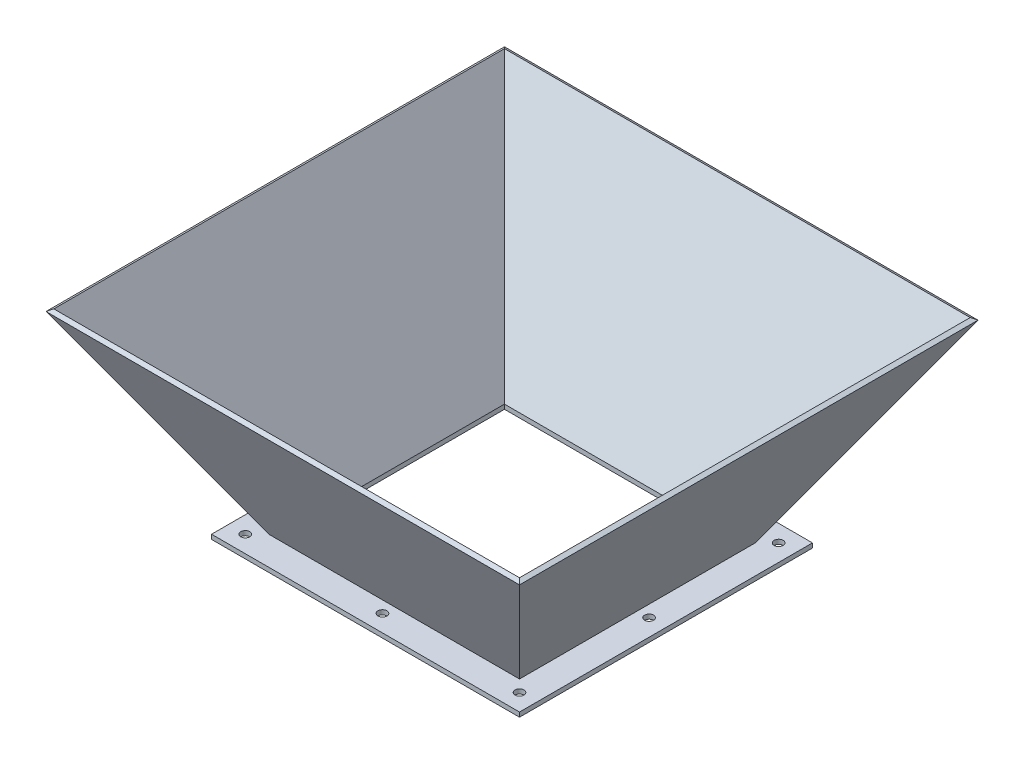
ISO-10303-21;
HEADER;
FILE_DESCRIPTION(('STEP AP214'),'2;1');
FILE_NAME('part.step','',(''),(''),'','','');
FILE_SCHEMA(('AUTOMOTIVE_DESIGN { 1 0 10303 214 1 1 1 1 }'));
ENDSEC;
DATA;
#1=APPLICATION_CONTEXT('core data for automotive mechanical design processes');
#2=APPLICATION_PROTOCOL_DEFINITION('international standard','automotive_design',2000,#1);
#3=PRODUCT_CONTEXT('',#1,'mechanical');
#4=PRODUCT('Part','Part','',(#3));
#5=PRODUCT_RELATED_PRODUCT_CATEGORY('part','',(#4));
#6=PRODUCT_DEFINITION_FORMATION('','',#4);
#7=PRODUCT_DEFINITION_CONTEXT('part definition',#1,'design');
#8=PRODUCT_DEFINITION('design','',#6,#7);
#9=PRODUCT_DEFINITION_SHAPE('','',#8);
#10=(LENGTH_UNIT() NAMED_UNIT(*) SI_UNIT(.MILLI.,.METRE.));
#11=(NAMED_UNIT(*) PLANE_ANGLE_UNIT() SI_UNIT($,.RADIAN.));
#12=(NAMED_UNIT(*) SI_UNIT($,.STERADIAN.) SOLID_ANGLE_UNIT());
#13=UNCERTAINTY_MEASURE_WITH_UNIT(LENGTH_MEASURE(1.E-05),#10,'distance_accuracy_value','');
#14=(GEOMETRIC_REPRESENTATION_CONTEXT(3) GLOBAL_UNCERTAINTY_ASSIGNED_CONTEXT((#13)) GLOBAL_UNIT_ASSIGNED_CONTEXT((#10,
#11,#12)) REPRESENTATION_CONTEXT('',''));
#15=CARTESIAN_POINT('',(0.,0.,0.));
#16=DIRECTION('',(0.,0.,1.));
#17=DIRECTION('',(1.,0.,0.));
#18=AXIS2_PLACEMENT_3D('',#15,#16,#17);
#19=CARTESIAN_POINT('',(-338.536777087592,0.,-200.));
#20=DIRECTION('',(0.,1.,0.));
#21=DIRECTION('',(0.,0.,1.));
#22=AXIS2_PLACEMENT_3D('',#19,#20,#21);
#23=PLANE('',#22);
#24=CARTESIAN_POINT('',(-91.25,0.,86.25));
#25=DIRECTION('',(0.,1.,0.));
#26=DIRECTION('',(0.,0.,1.));
#27=AXIS2_PLACEMENT_3D('',#24,#25,#26);
#28=CIRCLE('',#27,2.99999999999999);
#29=CARTESIAN_POINT('',(-91.25,0.,89.25));
#30=VERTEX_POINT('',#29);
#31=EDGE_CURVE('E548',#30,#30,#28,.T.);
#32=ORIENTED_EDGE('',*,*,#31,.F.);
#33=EDGE_LOOP('',(#32));
#34=FACE_BOUND('',#33,.T.);
#35=CARTESIAN_POINT('',(0.,0.,86.25));
#36=DIRECTION('',(0.,1.,0.));
#37=DIRECTION('',(0.,0.,1.));
#38=AXIS2_PLACEMENT_3D('',#35,#36,#37);
#39=CIRCLE('',#38,3.);
#40=CARTESIAN_POINT('',(0.,0.,89.25));
#41=VERTEX_POINT('',#40);
#42=EDGE_CURVE('E542',#41,#41,#39,.T.);
#43=ORIENTED_EDGE('',*,*,#42,.F.);
#44=EDGE_LOOP('',(#43));
#45=FACE_BOUND('',#44,.T.);
#46=CARTESIAN_POINT('',(91.25,0.,86.25));
#47=DIRECTION('',(0.,1.,0.));
#48=DIRECTION('',(0.,0.,1.));
#49=AXIS2_PLACEMENT_3D('',#46,#47,#48);
#50=CIRCLE('',#49,3.00000000000001);
#51=CARTESIAN_POINT('',(91.25,0.,89.25));
#52=VERTEX_POINT('',#51);
#53=EDGE_CURVE('E536',#52,#52,#50,.T.);
#54=ORIENTED_EDGE('',*,*,#53,.F.);
#55=EDGE_LOOP('',(#54));
#56=FACE_BOUND('',#55,.T.);
#57=CARTESIAN_POINT('',(91.25,0.,0.));
#58=DIRECTION('',(0.,1.,0.));
#59=DIRECTION('',(0.,0.,1.));
#60=AXIS2_PLACEMENT_3D('',#57,#58,#59);
#61=CIRCLE('',#60,3.00000000000001);
#62=CARTESIAN_POINT('',(91.25,0.,3.00000000000001));
#63=VERTEX_POINT('',#62);
#64=EDGE_CURVE('E530',#63,#63,#61,.T.);
#65=ORIENTED_EDGE('',*,*,#64,.F.);
#66=EDGE_LOOP('',(#65));
#67=FACE_BOUND('',#66,.T.);
#68=CARTESIAN_POINT('',(-91.25,0.,0.));
#69=DIRECTION('',(0.,1.,0.));
#70=DIRECTION('',(0.,0.,1.));
#71=AXIS2_PLACEMENT_3D('',#68,#69,#70);
#72=CIRCLE('',#71,2.99999999999999);
#73=CARTESIAN_POINT('',(-91.25,0.,2.99999999999999));
#74=VERTEX_POINT('',#73);
#75=EDGE_CURVE('E524',#74,#74,#72,.T.);
#76=ORIENTED_EDGE('',*,*,#75,.F.);
#77=EDGE_LOOP('',(#76));
#78=FACE_BOUND('',#77,.T.);
#79=CARTESIAN_POINT('',(91.25,0.,-86.25));
#80=DIRECTION('',(0.,1.,0.));
#81=DIRECTION('',(0.,0.,1.));
#82=AXIS2_PLACEMENT_3D('',#79,#80,#81);
#83=CIRCLE('',#82,3.00000000000001);
#84=CARTESIAN_POINT('',(91.25,0.,-83.25));
#85=VERTEX_POINT('',#84);
#86=EDGE_CURVE('E516',#85,#85,#83,.T.);
#87=ORIENTED_EDGE('',*,*,#86,.F.);
#88=EDGE_LOOP('',(#87));
#89=FACE_BOUND('',#88,.T.);
#90=CARTESIAN_POINT('',(0.,0.,-86.25));
#91=DIRECTION('',(0.,1.,0.));
#92=DIRECTION('',(0.,0.,1.));
#93=AXIS2_PLACEMENT_3D('',#90,#91,#92);
#94=CIRCLE('',#93,3.);
#95=CARTESIAN_POINT('',(0.,0.,-83.25));
#96=VERTEX_POINT('',#95);
#97=EDGE_CURVE('E508',#96,#96,#94,.T.);
#98=ORIENTED_EDGE('',*,*,#97,.F.);
#99=EDGE_LOOP('',(#98));
#100=FACE_BOUND('',#99,.T.);
#101=CARTESIAN_POINT('',(-91.25,0.,-86.25));
#102=DIRECTION('',(0.,1.,0.));
#103=DIRECTION('',(0.,0.,1.));
#104=AXIS2_PLACEMENT_3D('',#101,#102,#103);
#105=CIRCLE('',#104,2.99999999999999);
#106=CARTESIAN_POINT('',(-91.25,0.,-83.25));
#107=VERTEX_POINT('',#106);
#108=EDGE_CURVE('E514',#107,#107,#105,.T.);
#109=ORIENTED_EDGE('',*,*,#108,.F.);
#110=EDGE_LOOP('',(#109));
#111=FACE_BOUND('',#110,.T.);
#112=DIRECTION('',(1.,0.,0.));
#113=VECTOR('',#112,1.);
#114=CARTESIAN_POINT('',(-157.598076211354,-1.59225538229403E-13,-78.4641016151458));
#115=LINE('',#114,#113);
#116=CARTESIAN_POINT('',(-83.4641016151376,-1.62879495961588E-13,-78.4641016151458));
#117=VERTEX_POINT('',#116);
#118=CARTESIAN_POINT('',(83.4641016151376,-1.90635071577217E-13,-78.4641016151458));
#119=VERTEX_POINT('',#118);
#120=EDGE_CURVE('E203',#117,#119,#115,.T.);
#121=ORIENTED_EDGE('',*,*,#120,.T.);
#122=DIRECTION('',(0.,0.,1.));
#123=VECTOR('',#122,1.);
#124=CARTESIAN_POINT('',(83.4641016151377,0.,-200.));
#125=LINE('',#124,#123);
#126=CARTESIAN_POINT('',(83.4641016151377,-1.48134346415785E-13,78.4641016151459));
#127=VERTEX_POINT('',#126);
#128=EDGE_CURVE('E234',#119,#127,#125,.T.);
#129=ORIENTED_EDGE('',*,*,#128,.T.);
#130=DIRECTION('',(1.,0.,0.));
#131=VECTOR('',#130,1.);
#132=CARTESIAN_POINT('',(-338.536777087592,-1.59225538229403E-13,78.4641016151458));
#133=LINE('',#132,#131);
#134=CARTESIAN_POINT('',(-83.4641016151377,-1.41629133380872E-13,78.4641016151459));
#135=VERTEX_POINT('',#134);
#136=EDGE_CURVE('E297',#135,#127,#133,.T.);
#137=ORIENTED_EDGE('',*,*,#136,.F.);
#138=DIRECTION('',(0.,0.,1.));
#139=VECTOR('',#138,1.);
#140=CARTESIAN_POINT('',(-83.4641016151377,0.,-200.));
#141=LINE('',#140,#139);
#142=EDGE_CURVE('E254',#117,#135,#141,.T.);
#143=ORIENTED_EDGE('',*,*,#142,.F.);
#144=EDGE_LOOP('',(#121,#129,#137,#143));
#145=FACE_BOUND('',#144,.T.);
#146=DIRECTION('',(0.,0.,1.));
#147=VECTOR('',#146,1.);
#148=CARTESIAN_POINT('',(102.5,-1.66533453693773E-13,97.4999999999999));
#149=LINE('',#148,#147);
#150=CARTESIAN_POINT('',(102.5,-1.71032345999165E-13,-97.5));
#151=VERTEX_POINT('',#150);
#152=CARTESIAN_POINT('',(102.5,-1.66533453693774E-13,97.5));
#153=VERTEX_POINT('',#152);
#154=EDGE_CURVE('E275',#151,#153,#149,.T.);
#155=ORIENTED_EDGE('',*,*,#154,.F.);
#156=DIRECTION('',(1.,0.,0.));
#157=VECTOR('',#156,1.);
#158=CARTESIAN_POINT('',(-157.598076211354,-1.71032345999165E-13,-97.5));
#159=LINE('',#158,#157);
#160=CARTESIAN_POINT('',(-102.5,-1.71032345999165E-13,-97.5));
#161=VERTEX_POINT('',#160);
#162=EDGE_CURVE('E208',#161,#151,#159,.T.);
#163=ORIENTED_EDGE('',*,*,#162,.F.);
#164=DIRECTION('',(0.,0.,-1.));
#165=VECTOR('',#164,1.);
#166=CARTESIAN_POINT('',(-102.5,-1.66533453693773E-13,97.4999999999999));
#167=LINE('',#166,#165);
#168=CARTESIAN_POINT('',(-102.5,-1.66533453693773E-13,97.5));
#169=VERTEX_POINT('',#168);
#170=EDGE_CURVE('E278',#169,#161,#167,.T.);
#171=ORIENTED_EDGE('',*,*,#170,.F.);
#172=DIRECTION('',(1.,0.,0.));
#173=VECTOR('',#172,1.);
#174=CARTESIAN_POINT('',(-338.536777087592,-1.71032345999165E-13,97.5));
#175=LINE('',#174,#173);
#176=EDGE_CURVE('E316',#169,#153,#175,.T.);
#177=ORIENTED_EDGE('',*,*,#176,.T.);
#178=EDGE_LOOP('',(#155,#163,#171,#177));
#179=FACE_BOUND('',#178,.T.);
#180=ADVANCED_FACE('F40',(#34,#45,#56,#67,#78,#89,#100,#111,#145,#179),#23,.T.);
#181=CARTESIAN_POINT('',(-80.,-3.00000000000001,-200.));
#182=DIRECTION('',(1.,0.,0.));
#183=DIRECTION('',(0.,0.,-1.));
#184=AXIS2_PLACEMENT_3D('',#181,#182,#183);
#185=PLANE('',#184);
#186=DIRECTION('',(0.,0.,1.));
#187=VECTOR('',#186,1.);
#188=CARTESIAN_POINT('',(-80.,-3.00000000000001,-200.));
#189=LINE('',#188,#187);
#190=CARTESIAN_POINT('',(-80.,-3.00000000000001,-75.));
#191=VERTEX_POINT('',#190);
#192=CARTESIAN_POINT('',(-80.,-3.00000000000001,75.));
#193=VERTEX_POINT('',#192);
#194=EDGE_CURVE('E56',#191,#193,#189,.T.);
#195=ORIENTED_EDGE('',*,*,#194,.F.);
#196=DIRECTION('',(0.,1.,0.));
#197=VECTOR('',#196,1.);
#198=CARTESIAN_POINT('',(-80.,-3.,-75.));
#199=LINE('',#198,#197);
#200=CARTESIAN_POINT('',(-80.,-1.38777878078145E-13,-75.));
#201=VERTEX_POINT('',#200);
#202=EDGE_CURVE('E196',#191,#201,#199,.T.);
#203=ORIENTED_EDGE('',*,*,#202,.T.);
#204=DIRECTION('',(0.,0.,1.));
#205=VECTOR('',#204,1.);
#206=CARTESIAN_POINT('',(-80.,0.,-200.));
#207=LINE('',#206,#205);
#208=CARTESIAN_POINT('',(-80.0000000000081,1.41830991395864E-11,75.));
#209=VERTEX_POINT('',#208);
#210=EDGE_CURVE('E264',#201,#209,#207,.T.);
#211=ORIENTED_EDGE('',*,*,#210,.T.);
#212=DIRECTION('',(0.,-1.,0.));
#213=VECTOR('',#212,1.);
#214=CARTESIAN_POINT('',(-80.,0.,75.));
#215=LINE('',#214,#213);
#216=EDGE_CURVE('E257',#209,#193,#215,.T.);
#217=ORIENTED_EDGE('',*,*,#216,.T.);
#218=EDGE_LOOP('',(#195,#203,#211,#217));
#219=FACE_BOUND('',#218,.T.);
#220=ADVANCED_FACE('F349',(#219),#185,.T.);
#221=CARTESIAN_POINT('',(80.,-3.00000000000001,-200.));
#222=DIRECTION('',(-1.,0.,0.));
#223=DIRECTION('',(0.,0.,-1.));
#224=AXIS2_PLACEMENT_3D('',#221,#222,#223);
#225=PLANE('',#224);
#226=DIRECTION('',(0.,0.,1.));
#227=VECTOR('',#226,1.);
#228=CARTESIAN_POINT('',(80.,0.,-200.));
#229=LINE('',#228,#227);
#230=CARTESIAN_POINT('',(80.,-1.38777878078145E-13,-75.));
#231=VERTEX_POINT('',#230);
#232=CARTESIAN_POINT('',(80.0000000000082,1.41830991395864E-11,75.0000000000082));
#233=VERTEX_POINT('',#232);
#234=EDGE_CURVE('E157',#231,#233,#229,.T.);
#235=ORIENTED_EDGE('',*,*,#234,.F.);
#236=DIRECTION('',(0.,-1.,0.));
#237=VECTOR('',#236,1.);
#238=CARTESIAN_POINT('',(80.,-3.,-75.));
#239=LINE('',#238,#237);
#240=CARTESIAN_POINT('',(79.9999999999999,-3.00000000000001,-75.));
#241=VERTEX_POINT('',#240);
#242=EDGE_CURVE('E11',#231,#241,#239,.T.);
#243=ORIENTED_EDGE('',*,*,#242,.T.);
#244=DIRECTION('',(0.,0.,1.));
#245=VECTOR('',#244,1.);
#246=CARTESIAN_POINT('',(80.,-3.00000000000001,-200.));
#247=LINE('',#246,#245);
#248=CARTESIAN_POINT('',(80.,-3.00000000000001,75.));
#249=VERTEX_POINT('',#248);
#250=EDGE_CURVE('E63',#241,#249,#247,.T.);
#251=ORIENTED_EDGE('',*,*,#250,.T.);
#252=DIRECTION('',(0.,1.,0.));
#253=VECTOR('',#252,1.);
#254=CARTESIAN_POINT('',(80.,0.,75.));
#255=LINE('',#254,#253);
#256=EDGE_CURVE('E237',#249,#233,#255,.T.);
#257=ORIENTED_EDGE('',*,*,#256,.T.);
#258=EDGE_LOOP('',(#235,#243,#251,#257));
#259=FACE_BOUND('',#258,.T.);
#260=ADVANCED_FACE('F354',(#259),#225,.T.);
#261=CARTESIAN_POINT('',(-340.26882789516,-2.99999999999998,-200.));
#262=DIRECTION('',(0.,-1.,0.));
#263=DIRECTION('',(0.,0.,-1.));
#264=AXIS2_PLACEMENT_3D('',#261,#262,#263);
#265=PLANE('',#264);
#266=CARTESIAN_POINT('',(-91.25,-3.00000000000014,86.25));
#267=DIRECTION('',(0.,1.,0.));
#268=DIRECTION('',(0.,0.,1.));
#269=AXIS2_PLACEMENT_3D('',#266,#267,#268);
#270=CIRCLE('',#269,2.99999999999999);
#271=CARTESIAN_POINT('',(-91.25,-3.00000000000014,89.25));
#272=VERTEX_POINT('',#271);
#273=EDGE_CURVE('E401',#272,#272,#270,.T.);
#274=ORIENTED_EDGE('',*,*,#273,.T.);
#275=EDGE_LOOP('',(#274));
#276=FACE_BOUND('',#275,.T.);
#277=CARTESIAN_POINT('',(0.,-3.00000000000014,86.25));
#278=DIRECTION('',(0.,1.,0.));
#279=DIRECTION('',(0.,0.,1.));
#280=AXIS2_PLACEMENT_3D('',#277,#278,#279);
#281=CIRCLE('',#280,3.);
#282=CARTESIAN_POINT('',(0.,-3.00000000000014,89.25));
#283=VERTEX_POINT('',#282);
#284=EDGE_CURVE('E405',#283,#283,#281,.T.);
#285=ORIENTED_EDGE('',*,*,#284,.T.);
#286=EDGE_LOOP('',(#285));
#287=FACE_BOUND('',#286,.T.);
#288=CARTESIAN_POINT('',(91.25,-3.00000000000014,86.25));
#289=DIRECTION('',(0.,1.,0.));
#290=DIRECTION('',(0.,0.,1.));
#291=AXIS2_PLACEMENT_3D('',#288,#289,#290);
#292=CIRCLE('',#291,3.00000000000001);
#293=CARTESIAN_POINT('',(91.25,-3.00000000000014,89.25));
#294=VERTEX_POINT('',#293);
#295=EDGE_CURVE('E409',#294,#294,#292,.T.);
#296=ORIENTED_EDGE('',*,*,#295,.T.);
#297=EDGE_LOOP('',(#296));
#298=FACE_BOUND('',#297,.T.);
#299=CARTESIAN_POINT('',(91.25,-3.00000000000009,0.));
#300=DIRECTION('',(0.,1.,0.));
#301=DIRECTION('',(0.,0.,1.));
#302=AXIS2_PLACEMENT_3D('',#299,#300,#301);
#303=CIRCLE('',#302,3.00000000000001);
#304=CARTESIAN_POINT('',(91.25,-3.0000000000001,3.00000000000001));
#305=VERTEX_POINT('',#304);
#306=EDGE_CURVE('E413',#305,#305,#303,.T.);
#307=ORIENTED_EDGE('',*,*,#306,.T.);
#308=EDGE_LOOP('',(#307));
#309=FACE_BOUND('',#308,.T.);
#310=CARTESIAN_POINT('',(-91.25,-3.00000000000009,0.));
#311=DIRECTION('',(0.,1.,0.));
#312=DIRECTION('',(0.,0.,1.));
#313=AXIS2_PLACEMENT_3D('',#310,#311,#312);
#314=CIRCLE('',#313,2.99999999999999);
#315=CARTESIAN_POINT('',(-91.25,-3.0000000000001,2.99999999999999));
#316=VERTEX_POINT('',#315);
#317=EDGE_CURVE('E417',#316,#316,#314,.T.);
#318=ORIENTED_EDGE('',*,*,#317,.T.);
#319=EDGE_LOOP('',(#318));
#320=FACE_BOUND('',#319,.T.);
#321=CARTESIAN_POINT('',(91.25,-3.00000000000005,-86.25));
#322=DIRECTION('',(0.,1.,0.));
#323=DIRECTION('',(0.,0.,1.));
#324=AXIS2_PLACEMENT_3D('',#321,#322,#323);
#325=CIRCLE('',#324,3.00000000000001);
#326=CARTESIAN_POINT('',(91.25,-3.00000000000005,-83.25));
#327=VERTEX_POINT('',#326);
#328=EDGE_CURVE('E421',#327,#327,#325,.T.);
#329=ORIENTED_EDGE('',*,*,#328,.T.);
#330=EDGE_LOOP('',(#329));
#331=FACE_BOUND('',#330,.T.);
#332=CARTESIAN_POINT('',(0.,-3.00000000000005,-86.25));
#333=DIRECTION('',(0.,1.,0.));
#334=DIRECTION('',(0.,0.,1.));
#335=AXIS2_PLACEMENT_3D('',#332,#333,#334);
#336=CIRCLE('',#335,3.);
#337=CARTESIAN_POINT('',(0.,-3.00000000000005,-83.25));
#338=VERTEX_POINT('',#337);
#339=EDGE_CURVE('E425',#338,#338,#336,.T.);
#340=ORIENTED_EDGE('',*,*,#339,.T.);
#341=EDGE_LOOP('',(#340));
#342=FACE_BOUND('',#341,.T.);
#343=CARTESIAN_POINT('',(-91.25,-3.00000000000005,-86.25));
#344=DIRECTION('',(0.,1.,0.));
#345=DIRECTION('',(0.,0.,1.));
#346=AXIS2_PLACEMENT_3D('',#343,#344,#345);
#347=CIRCLE('',#346,2.99999999999999);
#348=CARTESIAN_POINT('',(-91.25,-3.00000000000005,-83.25));
#349=VERTEX_POINT('',#348);
#350=EDGE_CURVE('E179',#349,#349,#347,.T.);
#351=ORIENTED_EDGE('',*,*,#350,.T.);
#352=EDGE_LOOP('',(#351));
#353=FACE_BOUND('',#352,.T.);
#354=DIRECTION('',(1.,0.,0.));
#355=VECTOR('',#354,1.);
#356=CARTESIAN_POINT('',(-157.598076211354,-3.00000000000001,-97.5));
#357=LINE('',#356,#355);
#358=CARTESIAN_POINT('',(-102.5,-3.00000000000001,-97.5));
#359=VERTEX_POINT('',#358);
#360=CARTESIAN_POINT('',(102.5,-3.00000000000001,-97.5));
#361=VERTEX_POINT('',#360);
#362=EDGE_CURVE('E204',#359,#361,#357,.T.);
#363=ORIENTED_EDGE('',*,*,#362,.T.);
#364=DIRECTION('',(0.,0.,1.));
#365=VECTOR('',#364,1.);
#366=CARTESIAN_POINT('',(102.5,-3.00000000000001,97.5));
#367=LINE('',#366,#365);
#368=CARTESIAN_POINT('',(102.5,-3.00000000000001,97.5));
#369=VERTEX_POINT('',#368);
#370=EDGE_CURVE('E272',#361,#369,#367,.T.);
#371=ORIENTED_EDGE('',*,*,#370,.T.);
#372=DIRECTION('',(1.,0.,0.));
#373=VECTOR('',#372,1.);
#374=CARTESIAN_POINT('',(-340.26882789516,-3.00000000000001,97.5));
#375=LINE('',#374,#373);
#376=CARTESIAN_POINT('',(-102.5,-3.00000000000001,97.5));
#377=VERTEX_POINT('',#376);
#378=EDGE_CURVE('E312',#377,#369,#375,.T.);
#379=ORIENTED_EDGE('',*,*,#378,.F.);
#380=DIRECTION('',(0.,0.,-1.));
#381=VECTOR('',#380,1.);
#382=CARTESIAN_POINT('',(-102.5,-3.00000000000001,97.5));
#383=LINE('',#382,#381);
#384=EDGE_CURVE('E271',#377,#359,#383,.T.);
#385=ORIENTED_EDGE('',*,*,#384,.T.);
#386=EDGE_LOOP('',(#363,#371,#379,#385));
#387=FACE_BOUND('',#386,.T.);
#388=ORIENTED_EDGE('',*,*,#250,.F.);
#389=DIRECTION('',(1.,0.,0.));
#390=VECTOR('',#389,1.);
#391=CARTESIAN_POINT('',(-102.5,-3.00000000000001,-75.));
#392=LINE('',#391,#390);
#393=EDGE_CURVE('E190',#191,#241,#392,.T.);
#394=ORIENTED_EDGE('',*,*,#393,.F.);
#395=ORIENTED_EDGE('',*,*,#194,.T.);
#396=DIRECTION('',(1.,0.,0.));
#397=VECTOR('',#396,1.);
#398=CARTESIAN_POINT('',(-340.26882789516,-3.00000000000001,75.));
#399=LINE('',#398,#397);
#400=EDGE_CURVE('E308',#193,#249,#399,.T.);
#401=ORIENTED_EDGE('',*,*,#400,.T.);
#402=EDGE_LOOP('',(#388,#394,#395,#401));
#403=FACE_BOUND('',#402,.T.);
#404=ADVANCED_FACE('F386',(#276,#287,#298,#309,#320,#331,#342,#353,#387,#403),#265,.T.);
#405=CARTESIAN_POINT('',(-102.5,206.231059736403,97.5));
#406=DIRECTION('',(-1.,0.,0.));
#407=DIRECTION('',(0.,0.,1.));
#408=AXIS2_PLACEMENT_3D('',#405,#406,#407);
#409=PLANE('',#408);
#410=DIRECTION('',(0.,-1.,0.));
#411=VECTOR('',#410,1.);
#412=CARTESIAN_POINT('',(-102.5,206.231059736403,-97.5));
#413=LINE('',#412,#411);
#414=EDGE_CURVE('E216',#161,#359,#413,.T.);
#415=ORIENTED_EDGE('',*,*,#414,.T.);
#416=ORIENTED_EDGE('',*,*,#384,.F.);
#417=DIRECTION('',(0.,-1.,0.));
#418=VECTOR('',#417,1.);
#419=CARTESIAN_POINT('',(-102.5,206.231059736403,97.5));
#420=LINE('',#419,#418);
#421=EDGE_CURVE('E281',#169,#377,#420,.T.);
#422=ORIENTED_EDGE('',*,*,#421,.F.);
#423=ORIENTED_EDGE('',*,*,#170,.T.);
#424=EDGE_LOOP('',(#415,#416,#422,#423));
#425=FACE_BOUND('',#424,.T.);
#426=ADVANCED_FACE('F387',(#425),#409,.T.);
#427=CARTESIAN_POINT('',(102.5,206.231059736403,97.5));
#428=DIRECTION('',(1.,0.,0.));
#429=DIRECTION('',(0.,0.,-1.));
#430=AXIS2_PLACEMENT_3D('',#427,#428,#429);
#431=PLANE('',#430);
#432=ORIENTED_EDGE('',*,*,#154,.T.);
#433=DIRECTION('',(0.,-1.,0.));
#434=VECTOR('',#433,1.);
#435=CARTESIAN_POINT('',(102.5,206.231059736403,97.5));
#436=LINE('',#435,#434);
#437=EDGE_CURVE('E284',#153,#369,#436,.T.);
#438=ORIENTED_EDGE('',*,*,#437,.T.);
#439=ORIENTED_EDGE('',*,*,#370,.F.);
#440=DIRECTION('',(0.,1.,0.));
#441=VECTOR('',#440,1.);
#442=CARTESIAN_POINT('',(102.5,206.231059736403,-97.5));
#443=LINE('',#442,#441);
#444=EDGE_CURVE('E207',#361,#151,#443,.T.);
#445=ORIENTED_EDGE('',*,*,#444,.T.);
#446=EDGE_LOOP('',(#432,#438,#439,#445));
#447=FACE_BOUND('',#446,.T.);
#448=ADVANCED_FACE('F393',(#447),#431,.T.);
#449=CARTESIAN_POINT('',(-157.598076211354,128.403810567665,-200.));
#450=DIRECTION('',(-0.866025403784436,-0.500000000000004,0.));
#451=DIRECTION('',(0.500000000000004,-0.866025403784436,0.));
#452=AXIS2_PLACEMENT_3D('',#449,#450,#451);
#453=PLANE('',#452);
#454=DIRECTION('',(0.,0.,1.));
#455=VECTOR('',#454,1.);
#456=CARTESIAN_POINT('',(-157.598076211354,128.403810567665,-200.));
#457=LINE('',#456,#455);
#458=CARTESIAN_POINT('',(-157.598076211354,128.403810567668,-152.598076211346));
#459=VERTEX_POINT('',#458);
#460=CARTESIAN_POINT('',(-157.598076211354,128.403810567665,152.598076211344));
#461=VERTEX_POINT('',#460);
#462=EDGE_CURVE('E258',#459,#461,#457,.T.);
#463=ORIENTED_EDGE('',*,*,#462,.F.);
#464=DIRECTION('',(0.447213595499983,-0.774596669241517,0.447213595499874));
#465=VECTOR('',#464,1.);
#466=CARTESIAN_POINT('',(-167.078460969084,144.824318643355,-162.078460969072));
#467=LINE('',#466,#465);
#468=EDGE_CURVE('E223',#459,#117,#467,.T.);
#469=ORIENTED_EDGE('',*,*,#468,.T.);
#470=ORIENTED_EDGE('',*,*,#142,.T.);
#471=DIRECTION('',(0.447213595499983,-0.774596669241517,-0.447213595499874));
#472=VECTOR('',#471,1.);
#473=CARTESIAN_POINT('',(-87.0784609690944,6.2602540378647,82.0784609691017));
#474=LINE('',#473,#472);
#475=EDGE_CURVE('E250',#461,#135,#474,.T.);
#476=ORIENTED_EDGE('',*,*,#475,.F.);
#477=EDGE_LOOP('',(#463,#469,#470,#476));
#478=FACE_BOUND('',#477,.T.);
#479=ADVANCED_FACE('F340',(#478),#453,.T.);
#480=CARTESIAN_POINT('',(-155.000000000001,129.903810567665,-200.));
#481=DIRECTION('',(-0.500000000000003,0.866025403784437,0.));
#482=DIRECTION('',(-0.866025403784437,-0.500000000000003,0.));
#483=AXIS2_PLACEMENT_3D('',#480,#481,#482);
#484=PLANE('',#483);
#485=DIRECTION('',(0.654653670707966,0.377964473009223,0.65465367070799));
#486=VECTOR('',#485,1.);
#487=CARTESIAN_POINT('',(-176.428571428573,117.53201908503,-171.428571428571));
#488=LINE('',#487,#486);
#489=CARTESIAN_POINT('',(-155.000000000001,129.903810567665,-149.999999999998));
#490=VERTEX_POINT('',#489);
#491=EDGE_CURVE('E167',#459,#490,#488,.T.);
#492=ORIENTED_EDGE('',*,*,#491,.F.);
#493=ORIENTED_EDGE('',*,*,#462,.T.);
#494=DIRECTION('',(-0.654653670707966,-0.377964473009223,0.65465367070799));
#495=VECTOR('',#494,1.);
#496=CARTESIAN_POINT('',(-5.00000000000106,216.50635094611,-7.24420523567915E-12));
#497=LINE('',#496,#495);
#498=CARTESIAN_POINT('',(-155.000000000001,129.903810567665,149.999999999998));
#499=VERTEX_POINT('',#498);
#500=EDGE_CURVE('E246',#499,#461,#497,.T.);
#501=ORIENTED_EDGE('',*,*,#500,.F.);
#502=DIRECTION('',(0.,0.,1.));
#503=VECTOR('',#502,1.);
#504=CARTESIAN_POINT('',(-155.000000000001,129.903810567665,-200.));
#505=LINE('',#504,#503);
#506=EDGE_CURVE('E261',#490,#499,#505,.T.);
#507=ORIENTED_EDGE('',*,*,#506,.F.);
#508=EDGE_LOOP('',(#492,#493,#501,#507));
#509=FACE_BOUND('',#508,.T.);
#510=ADVANCED_FACE('F345',(#509),#484,.T.);
#511=CARTESIAN_POINT('',(-80.,0.,-200.));
#512=DIRECTION('',(0.866025403784436,0.500000000000004,0.));
#513=DIRECTION('',(-0.500000000000004,0.866025403784436,0.));
#514=AXIS2_PLACEMENT_3D('',#511,#512,#513);
#515=PLANE('',#514);
#516=DIRECTION('',(0.447213595499964,-0.774596669241485,0.447213595499949));
#517=VECTOR('',#516,1.);
#518=CARTESIAN_POINT('',(-98.7073554175205,32.4020900583941,-93.7073554175199));
#519=LINE('',#518,#517);
#520=EDGE_CURVE('E186',#490,#201,#519,.T.);
#521=ORIENTED_EDGE('',*,*,#520,.F.);
#522=ORIENTED_EDGE('',*,*,#506,.T.);
#523=DIRECTION('',(0.447213595499964,-0.774596669241485,-0.447213595499949));
#524=VECTOR('',#523,1.);
#525=CARTESIAN_POINT('',(-98.7073554175205,32.4020900583941,93.7073554175199));
#526=LINE('',#525,#524);
#527=EDGE_CURVE('E49',#499,#209,#526,.T.);
#528=ORIENTED_EDGE('',*,*,#527,.T.);
#529=ORIENTED_EDGE('',*,*,#210,.F.);
#530=EDGE_LOOP('',(#521,#522,#528,#529));
#531=FACE_BOUND('',#530,.T.);
#532=ADVANCED_FACE('F347',(#531),#515,.T.);
#533=CARTESIAN_POINT('',(157.598076211354,128.403810567665,-200.));
#534=DIRECTION('',(0.866025403784436,-0.500000000000004,0.));
#535=DIRECTION('',(-0.500000000000004,-0.866025403784436,0.));
#536=AXIS2_PLACEMENT_3D('',#533,#534,#535);
#537=PLANE('',#536);
#538=ORIENTED_EDGE('',*,*,#128,.F.);
#539=DIRECTION('',(0.447213595499983,0.774596669241517,-0.447213595499874));
#540=VECTOR('',#539,1.);
#541=CARTESIAN_POINT('',(167.078460969084,144.824318643355,-162.078460969072));
#542=LINE('',#541,#540);
#543=CARTESIAN_POINT('',(157.598076211354,128.403810567665,-152.598076211344));
#544=VERTEX_POINT('',#543);
#545=EDGE_CURVE('E220',#119,#544,#542,.T.);
#546=ORIENTED_EDGE('',*,*,#545,.T.);
#547=DIRECTION('',(0.,0.,1.));
#548=VECTOR('',#547,1.);
#549=CARTESIAN_POINT('',(157.598076211354,128.403810567665,-200.));
#550=LINE('',#549,#548);
#551=CARTESIAN_POINT('',(157.598076211354,128.403810567668,152.598076211346));
#552=VERTEX_POINT('',#551);
#553=EDGE_CURVE('E156',#544,#552,#550,.T.);
#554=ORIENTED_EDGE('',*,*,#553,.T.);
#555=DIRECTION('',(0.447213595499983,0.774596669241517,0.447213595499874));
#556=VECTOR('',#555,1.);
#557=CARTESIAN_POINT('',(87.0784609690944,6.2602540378647,82.0784609691017));
#558=LINE('',#557,#556);
#559=EDGE_CURVE('E230',#127,#552,#558,.T.);
#560=ORIENTED_EDGE('',*,*,#559,.F.);
#561=EDGE_LOOP('',(#538,#546,#554,#560));
#562=FACE_BOUND('',#561,.T.);
#563=ADVANCED_FACE('F330',(#562),#537,.T.);
#564=CARTESIAN_POINT('',(155.000000000001,129.903810567665,-200.));
#565=DIRECTION('',(0.500000000000003,0.866025403784437,0.));
#566=DIRECTION('',(0.866025403784437,-0.500000000000003,0.));
#567=AXIS2_PLACEMENT_3D('',#564,#565,#566);
#568=PLANE('',#567);
#569=DIRECTION('',(0.654653670707966,-0.377964473009223,-0.65465367070799));
#570=VECTOR('',#569,1.);
#571=CARTESIAN_POINT('',(176.428571428573,117.53201908503,-171.428571428571));
#572=LINE('',#571,#570);
#573=CARTESIAN_POINT('',(155.,129.903810567665,-149.999999999999));
#574=VERTEX_POINT('',#573);
#575=EDGE_CURVE('E161',#574,#544,#572,.T.);
#576=ORIENTED_EDGE('',*,*,#575,.F.);
#577=DIRECTION('',(0.,0.,1.));
#578=VECTOR('',#577,1.);
#579=CARTESIAN_POINT('',(155.000000000001,129.903810567665,-200.));
#580=LINE('',#579,#578);
#581=CARTESIAN_POINT('',(155.,129.903810567665,149.999999999999));
#582=VERTEX_POINT('',#581);
#583=EDGE_CURVE('E143',#574,#582,#580,.T.);
#584=ORIENTED_EDGE('',*,*,#583,.T.);
#585=DIRECTION('',(-0.654653670707966,0.377964473009223,-0.65465367070799));
#586=VECTOR('',#585,1.);
#587=CARTESIAN_POINT('',(5.000000000001,216.50635094611,-7.18869408444789E-12));
#588=LINE('',#587,#586);
#589=EDGE_CURVE('E227',#552,#582,#588,.T.);
#590=ORIENTED_EDGE('',*,*,#589,.F.);
#591=ORIENTED_EDGE('',*,*,#553,.F.);
#592=EDGE_LOOP('',(#576,#584,#590,#591));
#593=FACE_BOUND('',#592,.T.);
#594=ADVANCED_FACE('F162',(#593),#568,.T.);
#595=CARTESIAN_POINT('',(80.,0.,-200.));
#596=DIRECTION('',(-0.866025403784436,0.500000000000004,0.));
#597=DIRECTION('',(0.500000000000004,0.866025403784436,0.));
#598=AXIS2_PLACEMENT_3D('',#595,#596,#597);
#599=PLANE('',#598);
#600=DIRECTION('',(0.447213595499964,0.774596669241485,-0.447213595499949));
#601=VECTOR('',#600,1.);
#602=CARTESIAN_POINT('',(25.0000000000003,-95.2627944162865,-20.0000000000022));
#603=LINE('',#602,#601);
#604=EDGE_CURVE('E147',#231,#574,#603,.T.);
#605=ORIENTED_EDGE('',*,*,#604,.F.);
#606=ORIENTED_EDGE('',*,*,#234,.T.);
#607=DIRECTION('',(0.447213595499964,0.774596669241485,0.447213595499949));
#608=VECTOR('',#607,1.);
#609=CARTESIAN_POINT('',(25.0000000000003,-95.2627944162865,20.0000000000022));
#610=LINE('',#609,#608);
#611=EDGE_CURVE('E150',#233,#582,#610,.T.);
#612=ORIENTED_EDGE('',*,*,#611,.T.);
#613=ORIENTED_EDGE('',*,*,#583,.F.);
#614=EDGE_LOOP('',(#605,#606,#612,#613));
#615=FACE_BOUND('',#614,.T.);
#616=ADVANCED_FACE('F145',(#615),#599,.T.);
#617=CARTESIAN_POINT('',(-394.229597410619,-96.4627944162866,22.7712812921122));
#618=DIRECTION('',(0.,-0.499999999999992,0.866025403784443));
#619=DIRECTION('',(0.,-0.866025403784443,-0.499999999999992));
#620=AXIS2_PLACEMENT_3D('',#617,#618,#619);
#621=PLANE('',#620);
#622=DIRECTION('',(1.,0.,0.));
#623=VECTOR('',#622,1.);
#624=CARTESIAN_POINT('',(-264.402802491374,128.403810567669,152.598076211346));
#625=LINE('',#624,#623);
#626=EDGE_CURVE('E294',#461,#552,#625,.T.);
#627=ORIENTED_EDGE('',*,*,#626,.F.);
#628=ORIENTED_EDGE('',*,*,#475,.T.);
#629=ORIENTED_EDGE('',*,*,#136,.T.);
#630=ORIENTED_EDGE('',*,*,#559,.T.);
#631=EDGE_LOOP('',(#627,#628,#629,#630));
#632=FACE_BOUND('',#631,.T.);
#633=ADVANCED_FACE('F42',(#632),#621,.T.);
#634=CARTESIAN_POINT('',(-205.844469395283,229.829818696638,-23.0769230769271));
#635=DIRECTION('',(0.,0.866025403784443,0.499999999999992));
#636=DIRECTION('',(0.,-0.499999999999992,0.866025403784443));
#637=AXIS2_PLACEMENT_3D('',#634,#635,#636);
#638=PLANE('',#637);
#639=DIRECTION('',(1.,0.,0.));
#640=VECTOR('',#639,1.);
#641=CARTESIAN_POINT('',(-263.536777087591,129.903810567665,149.999999999999));
#642=LINE('',#641,#640);
#643=EDGE_CURVE('E301',#499,#582,#642,.T.);
#644=ORIENTED_EDGE('',*,*,#643,.F.);
#645=ORIENTED_EDGE('',*,*,#500,.T.);
#646=ORIENTED_EDGE('',*,*,#626,.T.);
#647=ORIENTED_EDGE('',*,*,#589,.T.);
#648=EDGE_LOOP('',(#644,#645,#646,#647));
#649=FACE_BOUND('',#648,.T.);
#650=ADVANCED_FACE('F334',(#649),#638,.T.);
#651=CARTESIAN_POINT('',(-393.536777087591,-95.2627944162865,20.0000000000022));
#652=DIRECTION('',(0.,0.499999999999991,-0.866025403784443));
#653=DIRECTION('',(0.,0.866025403784444,0.499999999999992));
#654=AXIS2_PLACEMENT_3D('',#651,#652,#653);
#655=PLANE('',#654);
#656=ORIENTED_EDGE('',*,*,#527,.F.);
#657=ORIENTED_EDGE('',*,*,#643,.T.);
#658=ORIENTED_EDGE('',*,*,#611,.F.);
#659=DIRECTION('',(1.,0.,0.));
#660=VECTOR('',#659,1.);
#661=CARTESIAN_POINT('',(-338.536777087583,1.41830991395864E-11,75.0000000000082));
#662=LINE('',#661,#660);
#663=EDGE_CURVE('E304',#209,#233,#662,.T.);
#664=ORIENTED_EDGE('',*,*,#663,.F.);
#665=EDGE_LOOP('',(#656,#657,#658,#664));
#666=FACE_BOUND('',#665,.T.);
#667=ADVANCED_FACE('F360',(#666),#655,.T.);
#668=CARTESIAN_POINT('',(-338.536777087592,0.,75.));
#669=DIRECTION('',(0.,0.,-1.));
#670=DIRECTION('',(-1.,0.,0.));
#671=AXIS2_PLACEMENT_3D('',#668,#669,#670);
#672=PLANE('',#671);
#673=ORIENTED_EDGE('',*,*,#256,.F.);
#674=ORIENTED_EDGE('',*,*,#400,.F.);
#675=ORIENTED_EDGE('',*,*,#216,.F.);
#676=ORIENTED_EDGE('',*,*,#663,.T.);
#677=EDGE_LOOP('',(#673,#674,#675,#676));
#678=FACE_BOUND('',#677,.T.);
#679=ADVANCED_FACE('F357',(#678),#672,.T.);
#680=CARTESIAN_POINT('',(-338.536777087592,0.,97.5));
#681=DIRECTION('',(0.,0.,1.));
#682=DIRECTION('',(1.,0.,0.));
#683=AXIS2_PLACEMENT_3D('',#680,#681,#682);
#684=PLANE('',#683);
#685=ORIENTED_EDGE('',*,*,#378,.T.);
#686=ORIENTED_EDGE('',*,*,#437,.F.);
#687=ORIENTED_EDGE('',*,*,#176,.F.);
#688=ORIENTED_EDGE('',*,*,#421,.T.);
#689=EDGE_LOOP('',(#685,#686,#687,#688));
#690=FACE_BOUND('',#689,.T.);
#691=ADVANCED_FACE('F369',(#690),#684,.T.);
#692=CARTESIAN_POINT('',(-157.598076211354,128.403810567669,-152.598076211346));
#693=DIRECTION('',(0.,-0.499999999999913,-0.866025403784489));
#694=DIRECTION('',(0.,0.866025403784489,-0.499999999999913));
#695=AXIS2_PLACEMENT_3D('',#692,#693,#694);
#696=PLANE('',#695);
#697=DIRECTION('',(1.,0.,0.));
#698=VECTOR('',#697,1.);
#699=CARTESIAN_POINT('',(-157.598076211354,128.403810567668,-152.598076211346));
#700=LINE('',#699,#698);
#701=EDGE_CURVE('E168',#459,#544,#700,.T.);
#702=ORIENTED_EDGE('',*,*,#701,.T.);
#703=ORIENTED_EDGE('',*,*,#545,.F.);
#704=ORIENTED_EDGE('',*,*,#120,.F.);
#705=ORIENTED_EDGE('',*,*,#468,.F.);
#706=EDGE_LOOP('',(#702,#703,#704,#705));
#707=FACE_BOUND('',#706,.T.);
#708=ADVANCED_FACE('F344',(#707),#696,.T.);
#709=CARTESIAN_POINT('',(-157.598076211354,-1.71032345999165E-13,-97.5));
#710=DIRECTION('',(0.,0.,-1.));
#711=DIRECTION('',(-1.,0.,0.));
#712=AXIS2_PLACEMENT_3D('',#709,#710,#711);
#713=PLANE('',#712);
#714=ORIENTED_EDGE('',*,*,#444,.F.);
#715=ORIENTED_EDGE('',*,*,#362,.F.);
#716=ORIENTED_EDGE('',*,*,#414,.F.);
#717=ORIENTED_EDGE('',*,*,#162,.T.);
#718=EDGE_LOOP('',(#714,#715,#716,#717));
#719=FACE_BOUND('',#718,.T.);
#720=ADVANCED_FACE('F436',(#719),#713,.T.);
#721=CARTESIAN_POINT('',(0.,162.379763209582,-93.7499999999968));
#722=DIRECTION('',(0.,-0.866025403784445,0.499999999999989));
#723=DIRECTION('',(0.,0.499999999999989,0.866025403784445));
#724=AXIS2_PLACEMENT_3D('',#721,#722,#723);
#725=PLANE('',#724);
#726=ORIENTED_EDGE('',*,*,#491,.T.);
#727=DIRECTION('',(1.,0.,0.));
#728=VECTOR('',#727,1.);
#729=CARTESIAN_POINT('',(-263.536777087591,129.903810567665,-149.999999999999));
#730=LINE('',#729,#728);
#731=EDGE_CURVE('E175',#490,#574,#730,.T.);
#732=ORIENTED_EDGE('',*,*,#731,.T.);
#733=ORIENTED_EDGE('',*,*,#575,.T.);
#734=ORIENTED_EDGE('',*,*,#701,.F.);
#735=EDGE_LOOP('',(#726,#732,#733,#734));
#736=FACE_BOUND('',#735,.T.);
#737=ADVANCED_FACE('F182',(#736),#725,.F.);
#738=CARTESIAN_POINT('',(-102.5,206.231059736403,-75.));
#739=DIRECTION('',(0.,0.,-1.));
#740=DIRECTION('',(-1.,0.,0.));
#741=AXIS2_PLACEMENT_3D('',#738,#739,#740);
#742=PLANE('',#741);
#743=DIRECTION('',(1.,0.,0.));
#744=VECTOR('',#743,1.);
#745=CARTESIAN_POINT('',(-338.536777087583,1.41830991395864E-11,-75.0000000000082));
#746=LINE('',#745,#744);
#747=EDGE_CURVE('E177',#201,#231,#746,.T.);
#748=ORIENTED_EDGE('',*,*,#747,.F.);
#749=ORIENTED_EDGE('',*,*,#202,.F.);
#750=ORIENTED_EDGE('',*,*,#393,.T.);
#751=ORIENTED_EDGE('',*,*,#242,.F.);
#752=EDGE_LOOP('',(#748,#749,#750,#751));
#753=FACE_BOUND('',#752,.T.);
#754=ADVANCED_FACE('F352',(#753),#742,.F.);
#755=CARTESIAN_POINT('',(-393.536777087591,-95.2627944162865,-20.0000000000022));
#756=DIRECTION('',(0.,0.499999999999991,0.866025403784443));
#757=DIRECTION('',(0.,0.866025403784444,-0.499999999999992));
#758=AXIS2_PLACEMENT_3D('',#755,#756,#757);
#759=PLANE('',#758);
#760=ORIENTED_EDGE('',*,*,#520,.T.);
#761=ORIENTED_EDGE('',*,*,#747,.T.);
#762=ORIENTED_EDGE('',*,*,#604,.T.);
#763=ORIENTED_EDGE('',*,*,#731,.F.);
#764=EDGE_LOOP('',(#760,#761,#762,#763));
#765=FACE_BOUND('',#764,.T.);
#766=ADVANCED_FACE('F174',(#765),#759,.T.);
#767=CARTESIAN_POINT('',(-91.25,-3.00000000000005,-86.25));
#768=DIRECTION('',(0.,1.,0.));
#769=DIRECTION('',(0.,0.,1.));
#770=AXIS2_PLACEMENT_3D('',#767,#768,#769);
#771=CYLINDRICAL_SURFACE('',#770,2.99999999999999);
#772=ORIENTED_EDGE('',*,*,#350,.F.);
#773=EDGE_LOOP('',(#772));
#774=FACE_BOUND('',#773,.T.);
#775=ORIENTED_EDGE('',*,*,#108,.T.);
#776=EDGE_LOOP('',(#775));
#777=FACE_BOUND('',#776,.T.);
#778=ADVANCED_FACE('F472',(#774,#777),#771,.F.);
#779=CARTESIAN_POINT('',(0.,-3.00000000000005,-86.25));
#780=DIRECTION('',(0.,1.,0.));
#781=DIRECTION('',(0.,0.,1.));
#782=AXIS2_PLACEMENT_3D('',#779,#780,#781);
#783=CYLINDRICAL_SURFACE('',#782,3.);
#784=ORIENTED_EDGE('',*,*,#339,.F.);
#785=EDGE_LOOP('',(#784));
#786=FACE_BOUND('',#785,.T.);
#787=ORIENTED_EDGE('',*,*,#97,.T.);
#788=EDGE_LOOP('',(#787));
#789=FACE_BOUND('',#788,.T.);
#790=ADVANCED_FACE('F475',(#786,#789),#783,.F.);
#791=CARTESIAN_POINT('',(91.25,-3.00000000000005,-86.25));
#792=DIRECTION('',(0.,1.,0.));
#793=DIRECTION('',(0.,0.,1.));
#794=AXIS2_PLACEMENT_3D('',#791,#792,#793);
#795=CYLINDRICAL_SURFACE('',#794,3.00000000000001);
#796=ORIENTED_EDGE('',*,*,#328,.F.);
#797=EDGE_LOOP('',(#796));
#798=FACE_BOUND('',#797,.T.);
#799=ORIENTED_EDGE('',*,*,#86,.T.);
#800=EDGE_LOOP('',(#799));
#801=FACE_BOUND('',#800,.T.);
#802=ADVANCED_FACE('F496',(#798,#801),#795,.F.);
#803=CARTESIAN_POINT('',(-91.25,-3.00000000000009,0.));
#804=DIRECTION('',(0.,1.,0.));
#805=DIRECTION('',(0.,0.,1.));
#806=AXIS2_PLACEMENT_3D('',#803,#804,#805);
#807=CYLINDRICAL_SURFACE('',#806,2.99999999999999);
#808=ORIENTED_EDGE('',*,*,#317,.F.);
#809=EDGE_LOOP('',(#808));
#810=FACE_BOUND('',#809,.T.);
#811=ORIENTED_EDGE('',*,*,#75,.T.);
#812=EDGE_LOOP('',(#811));
#813=FACE_BOUND('',#812,.T.);
#814=ADVANCED_FACE('F492',(#810,#813),#807,.F.);
#815=CARTESIAN_POINT('',(91.25,-3.00000000000009,0.));
#816=DIRECTION('',(0.,1.,0.));
#817=DIRECTION('',(0.,0.,1.));
#818=AXIS2_PLACEMENT_3D('',#815,#816,#817);
#819=CYLINDRICAL_SURFACE('',#818,3.00000000000001);
#820=ORIENTED_EDGE('',*,*,#306,.F.);
#821=EDGE_LOOP('',(#820));
#822=FACE_BOUND('',#821,.T.);
#823=ORIENTED_EDGE('',*,*,#64,.T.);
#824=EDGE_LOOP('',(#823));
#825=FACE_BOUND('',#824,.T.);
#826=ADVANCED_FACE('F488',(#822,#825),#819,.F.);
#827=CARTESIAN_POINT('',(91.25,-3.00000000000014,86.25));
#828=DIRECTION('',(0.,1.,0.));
#829=DIRECTION('',(0.,0.,1.));
#830=AXIS2_PLACEMENT_3D('',#827,#828,#829);
#831=CYLINDRICAL_SURFACE('',#830,3.00000000000001);
#832=ORIENTED_EDGE('',*,*,#295,.F.);
#833=EDGE_LOOP('',(#832));
#834=FACE_BOUND('',#833,.T.);
#835=ORIENTED_EDGE('',*,*,#53,.T.);
#836=EDGE_LOOP('',(#835));
#837=FACE_BOUND('',#836,.T.);
#838=ADVANCED_FACE('F484',(#834,#837),#831,.F.);
#839=CARTESIAN_POINT('',(0.,-3.00000000000014,86.25));
#840=DIRECTION('',(0.,1.,0.));
#841=DIRECTION('',(0.,0.,1.));
#842=AXIS2_PLACEMENT_3D('',#839,#840,#841);
#843=CYLINDRICAL_SURFACE('',#842,3.);
#844=ORIENTED_EDGE('',*,*,#284,.F.);
#845=EDGE_LOOP('',(#844));
#846=FACE_BOUND('',#845,.T.);
#847=ORIENTED_EDGE('',*,*,#42,.T.);
#848=EDGE_LOOP('',(#847));
#849=FACE_BOUND('',#848,.T.);
#850=ADVANCED_FACE('F480',(#846,#849),#843,.F.);
#851=CARTESIAN_POINT('',(-91.25,-3.00000000000014,86.25));
#852=DIRECTION('',(0.,1.,0.));
#853=DIRECTION('',(0.,0.,1.));
#854=AXIS2_PLACEMENT_3D('',#851,#852,#853);
#855=CYLINDRICAL_SURFACE('',#854,2.99999999999999);
#856=ORIENTED_EDGE('',*,*,#273,.F.);
#857=EDGE_LOOP('',(#856));
#858=FACE_BOUND('',#857,.T.);
#859=ORIENTED_EDGE('',*,*,#31,.T.);
#860=EDGE_LOOP('',(#859));
#861=FACE_BOUND('',#860,.T.);
#862=ADVANCED_FACE('F477',(#858,#861),#855,.F.);
#863=CLOSED_SHELL('',(#180,#220,#260,#404,#426,#448,#479,#510,#532,#563,#594,#616,#633,#650,
#667,#679,#691,#708,#720,#737,#754,#766,#778,#790,#802,#814,#826,#838,#850,#862));
#864=MANIFOLD_SOLID_BREP('B2',#863);
#865=ADVANCED_BREP_SHAPE_REPRESENTATION('',(#18,#864),#14);
#866=SHAPE_DEFINITION_REPRESENTATION(#9,#865);
ENDSEC;
END-ISO-10303-21;
